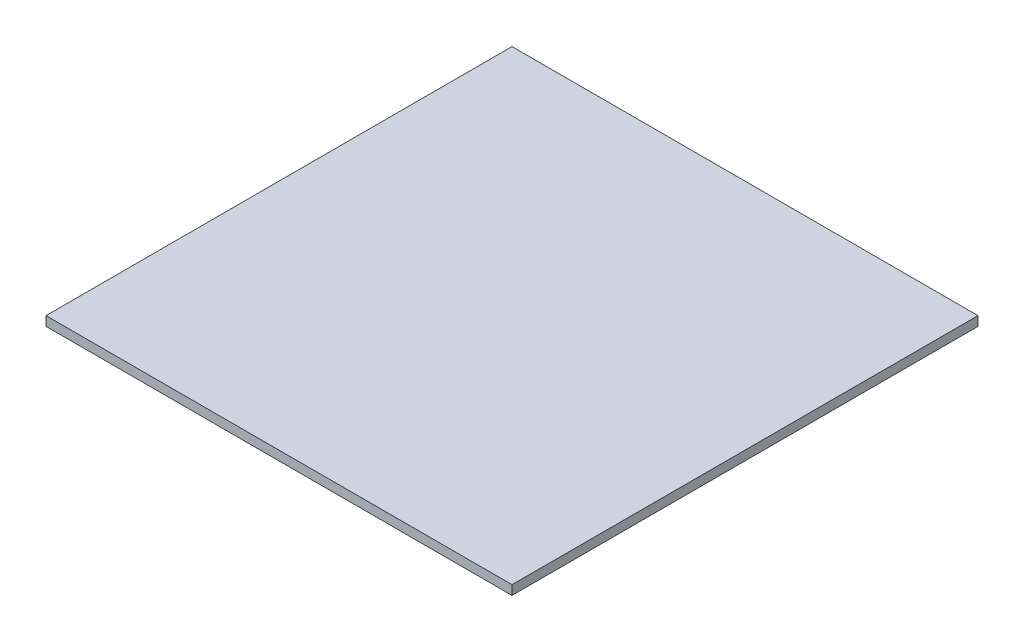
ISO-10303-21;
HEADER;
FILE_DESCRIPTION(('STEP AP214'),'2;1');
FILE_NAME('part.step','',(''),(''),'','','');
FILE_SCHEMA(('AUTOMOTIVE_DESIGN { 1 0 10303 214 1 1 1 1 }'));
ENDSEC;
DATA;
#1=APPLICATION_CONTEXT('core data for automotive mechanical design processes');
#2=APPLICATION_PROTOCOL_DEFINITION('international standard','automotive_design',2000,#1);
#3=PRODUCT_CONTEXT('',#1,'mechanical');
#4=PRODUCT('Part','Part','',(#3));
#5=PRODUCT_RELATED_PRODUCT_CATEGORY('part','',(#4));
#6=PRODUCT_DEFINITION_FORMATION('','',#4);
#7=PRODUCT_DEFINITION_CONTEXT('part definition',#1,'design');
#8=PRODUCT_DEFINITION('design','',#6,#7);
#9=PRODUCT_DEFINITION_SHAPE('','',#8);
#10=(LENGTH_UNIT() NAMED_UNIT(*) SI_UNIT(.MILLI.,.METRE.));
#11=(NAMED_UNIT(*) PLANE_ANGLE_UNIT() SI_UNIT($,.RADIAN.));
#12=(NAMED_UNIT(*) SI_UNIT($,.STERADIAN.) SOLID_ANGLE_UNIT());
#13=UNCERTAINTY_MEASURE_WITH_UNIT(LENGTH_MEASURE(1.E-05),#10,'distance_accuracy_value','');
#14=(GEOMETRIC_REPRESENTATION_CONTEXT(3) GLOBAL_UNCERTAINTY_ASSIGNED_CONTEXT((#13)) GLOBAL_UNIT_ASSIGNED_CONTEXT((#10,
#11,#12)) REPRESENTATION_CONTEXT('',''));
#15=CARTESIAN_POINT('',(0.,0.,0.));
#16=DIRECTION('',(0.,0.,1.));
#17=DIRECTION('',(1.,0.,0.));
#18=AXIS2_PLACEMENT_3D('',#15,#16,#17);
#19=CARTESIAN_POINT('',(40.,1.6,-40.));
#20=DIRECTION('',(-1.,0.,0.));
#21=DIRECTION('',(0.,0.,1.));
#22=AXIS2_PLACEMENT_3D('',#19,#20,#21);
#23=PLANE('',#22);
#24=DIRECTION('',(0.,0.,-1.));
#25=VECTOR('',#24,1.);
#26=CARTESIAN_POINT('',(40.,0.,-40.));
#27=LINE('',#26,#25);
#28=CARTESIAN_POINT('',(40.,0.,40.));
#29=VERTEX_POINT('',#28);
#30=CARTESIAN_POINT('',(40.,0.,-40.));
#31=VERTEX_POINT('',#30);
#32=EDGE_CURVE('E106',#29,#31,#27,.T.);
#33=ORIENTED_EDGE('',*,*,#32,.T.);
#34=DIRECTION('',(0.,-1.,0.));
#35=VECTOR('',#34,1.);
#36=CARTESIAN_POINT('',(40.,1.6,-40.));
#37=LINE('',#36,#35);
#38=CARTESIAN_POINT('',(40.,1.6,-40.));
#39=VERTEX_POINT('',#38);
#40=EDGE_CURVE('E11',#39,#31,#37,.T.);
#41=ORIENTED_EDGE('',*,*,#40,.F.);
#42=DIRECTION('',(0.,0.,-1.));
#43=VECTOR('',#42,1.);
#44=CARTESIAN_POINT('',(40.,1.6,-40.));
#45=LINE('',#44,#43);
#46=CARTESIAN_POINT('',(40.,1.6,40.));
#47=VERTEX_POINT('',#46);
#48=EDGE_CURVE('E93',#47,#39,#45,.T.);
#49=ORIENTED_EDGE('',*,*,#48,.F.);
#50=DIRECTION('',(0.,-1.,0.));
#51=VECTOR('',#50,1.);
#52=CARTESIAN_POINT('',(40.,1.6,40.));
#53=LINE('',#52,#51);
#54=EDGE_CURVE('E102',#47,#29,#53,.T.);
#55=ORIENTED_EDGE('',*,*,#54,.T.);
#56=EDGE_LOOP('',(#33,#41,#49,#55));
#57=FACE_BOUND('',#56,.T.);
#58=ADVANCED_FACE('F39',(#57),#23,.F.);
#59=CARTESIAN_POINT('',(-40.,1.6,-40.));
#60=DIRECTION('',(0.,0.,1.));
#61=DIRECTION('',(1.,0.,0.));
#62=AXIS2_PLACEMENT_3D('',#59,#60,#61);
#63=PLANE('',#62);
#64=DIRECTION('',(-1.,0.,0.));
#65=VECTOR('',#64,1.);
#66=CARTESIAN_POINT('',(-40.,0.,-40.));
#67=LINE('',#66,#65);
#68=CARTESIAN_POINT('',(-40.,0.,-40.));
#69=VERTEX_POINT('',#68);
#70=EDGE_CURVE('E98',#31,#69,#67,.T.);
#71=ORIENTED_EDGE('',*,*,#70,.T.);
#72=DIRECTION('',(0.,-1.,0.));
#73=VECTOR('',#72,1.);
#74=CARTESIAN_POINT('',(-40.,1.6,-40.));
#75=LINE('',#74,#73);
#76=CARTESIAN_POINT('',(-40.,1.6,-40.));
#77=VERTEX_POINT('',#76);
#78=EDGE_CURVE('E48',#77,#69,#75,.T.);
#79=ORIENTED_EDGE('',*,*,#78,.F.);
#80=DIRECTION('',(-1.,0.,0.));
#81=VECTOR('',#80,1.);
#82=CARTESIAN_POINT('',(-40.,1.6,-40.));
#83=LINE('',#82,#81);
#84=EDGE_CURVE('E88',#39,#77,#83,.T.);
#85=ORIENTED_EDGE('',*,*,#84,.F.);
#86=ORIENTED_EDGE('',*,*,#40,.T.);
#87=EDGE_LOOP('',(#71,#79,#85,#86));
#88=FACE_BOUND('',#87,.T.);
#89=ADVANCED_FACE('F97',(#88),#63,.F.);
#90=CARTESIAN_POINT('',(-40.,1.6,-40.));
#91=DIRECTION('',(1.,0.,0.));
#92=DIRECTION('',(0.,0.,-1.));
#93=AXIS2_PLACEMENT_3D('',#90,#91,#92);
#94=PLANE('',#93);
#95=DIRECTION('',(0.,0.,1.));
#96=VECTOR('',#95,1.);
#97=CARTESIAN_POINT('',(-40.,0.,-40.));
#98=LINE('',#97,#96);
#99=CARTESIAN_POINT('',(-40.,0.,40.));
#100=VERTEX_POINT('',#99);
#101=EDGE_CURVE('E74',#69,#100,#98,.T.);
#102=ORIENTED_EDGE('',*,*,#101,.T.);
#103=DIRECTION('',(0.,-1.,0.));
#104=VECTOR('',#103,1.);
#105=CARTESIAN_POINT('',(-40.,1.6,40.));
#106=LINE('',#105,#104);
#107=CARTESIAN_POINT('',(-40.,1.6,40.));
#108=VERTEX_POINT('',#107);
#109=EDGE_CURVE('E99',#108,#100,#106,.T.);
#110=ORIENTED_EDGE('',*,*,#109,.F.);
#111=DIRECTION('',(0.,0.,1.));
#112=VECTOR('',#111,1.);
#113=CARTESIAN_POINT('',(-40.,1.6,-40.));
#114=LINE('',#113,#112);
#115=EDGE_CURVE('E91',#77,#108,#114,.T.);
#116=ORIENTED_EDGE('',*,*,#115,.F.);
#117=ORIENTED_EDGE('',*,*,#78,.T.);
#118=EDGE_LOOP('',(#102,#110,#116,#117));
#119=FACE_BOUND('',#118,.T.);
#120=ADVANCED_FACE('F100',(#119),#94,.F.);
#121=CARTESIAN_POINT('',(-40.,1.6,40.));
#122=DIRECTION('',(0.,0.,-1.));
#123=DIRECTION('',(-1.,0.,0.));
#124=AXIS2_PLACEMENT_3D('',#121,#122,#123);
#125=PLANE('',#124);
#126=DIRECTION('',(1.,0.,0.));
#127=VECTOR('',#126,1.);
#128=CARTESIAN_POINT('',(-40.,0.,40.));
#129=LINE('',#128,#127);
#130=EDGE_CURVE('E80',#100,#29,#129,.T.);
#131=ORIENTED_EDGE('',*,*,#130,.T.);
#132=ORIENTED_EDGE('',*,*,#54,.F.);
#133=DIRECTION('',(1.,0.,0.));
#134=VECTOR('',#133,1.);
#135=CARTESIAN_POINT('',(-40.,1.6,40.));
#136=LINE('',#135,#134);
#137=EDGE_CURVE('E56',#108,#47,#136,.T.);
#138=ORIENTED_EDGE('',*,*,#137,.F.);
#139=ORIENTED_EDGE('',*,*,#109,.T.);
#140=EDGE_LOOP('',(#131,#132,#138,#139));
#141=FACE_BOUND('',#140,.T.);
#142=ADVANCED_FACE('F115',(#141),#125,.F.);
#143=CARTESIAN_POINT('',(0.,1.6,0.));
#144=DIRECTION('',(0.,1.,0.));
#145=DIRECTION('',(0.,0.,1.));
#146=AXIS2_PLACEMENT_3D('',#143,#144,#145);
#147=PLANE('',#146);
#148=ORIENTED_EDGE('',*,*,#48,.T.);
#149=ORIENTED_EDGE('',*,*,#84,.T.);
#150=ORIENTED_EDGE('',*,*,#115,.T.);
#151=ORIENTED_EDGE('',*,*,#137,.T.);
#152=EDGE_LOOP('',(#148,#149,#150,#151));
#153=FACE_BOUND('',#152,.T.);
#154=ADVANCED_FACE('F89',(#153),#147,.T.);
#155=CARTESIAN_POINT('',(0.,0.,0.));
#156=DIRECTION('',(0.,1.,0.));
#157=DIRECTION('',(0.,0.,1.));
#158=AXIS2_PLACEMENT_3D('',#155,#156,#157);
#159=PLANE('',#158);
#160=ORIENTED_EDGE('',*,*,#32,.F.);
#161=ORIENTED_EDGE('',*,*,#130,.F.);
#162=ORIENTED_EDGE('',*,*,#101,.F.);
#163=ORIENTED_EDGE('',*,*,#70,.F.);
#164=EDGE_LOOP('',(#160,#161,#162,#163));
#165=FACE_BOUND('',#164,.T.);
#166=ADVANCED_FACE('F118',(#165),#159,.F.);
#167=CLOSED_SHELL('',(#58,#89,#120,#142,#154,#166));
#168=MANIFOLD_SOLID_BREP('B2',#167);
#169=ADVANCED_BREP_SHAPE_REPRESENTATION('',(#18,#168),#14);
#170=SHAPE_DEFINITION_REPRESENTATION(#9,#169);
ENDSEC;
END-ISO-10303-21;
